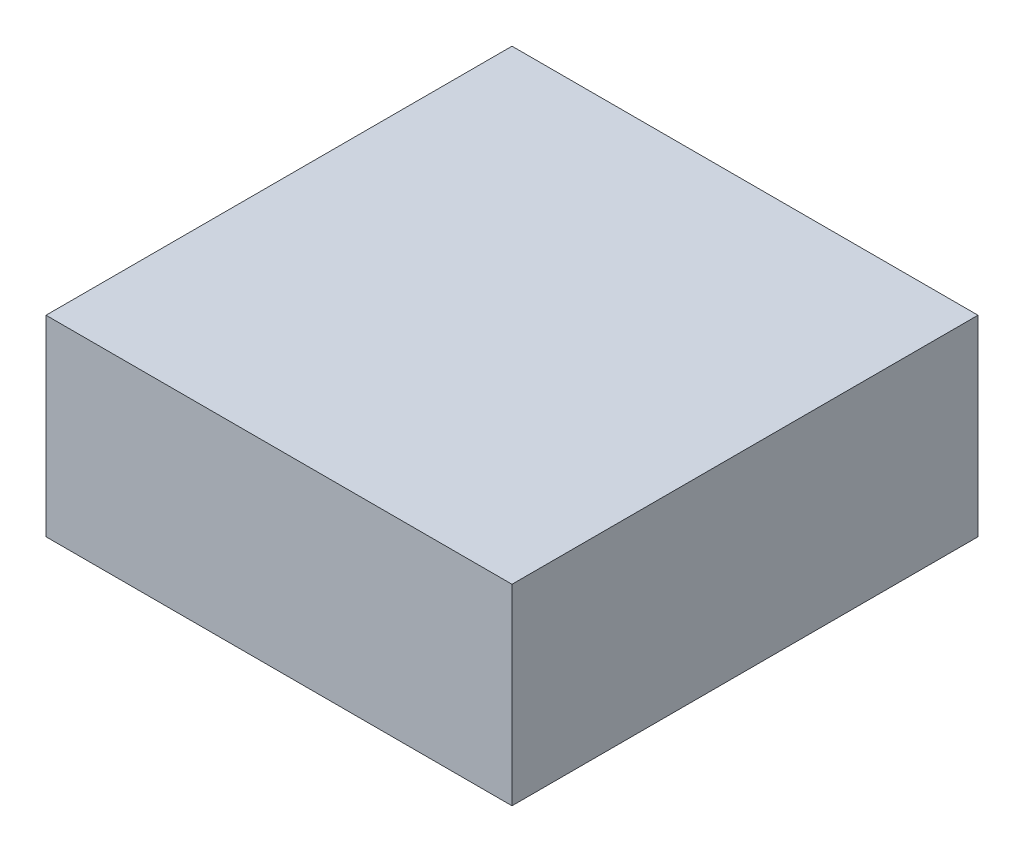
ISO-10303-21;
HEADER;
FILE_DESCRIPTION(('STEP AP214'),'2;1');
FILE_NAME('part.step','',(''),(''),'','','');
FILE_SCHEMA(('AUTOMOTIVE_DESIGN { 1 0 10303 214 1 1 1 1 }'));
ENDSEC;
DATA;
#1=APPLICATION_CONTEXT('core data for automotive mechanical design processes');
#2=APPLICATION_PROTOCOL_DEFINITION('international standard','automotive_design',2000,#1);
#3=PRODUCT_CONTEXT('',#1,'mechanical');
#4=PRODUCT('Part','Part','',(#3));
#5=PRODUCT_RELATED_PRODUCT_CATEGORY('part','',(#4));
#6=PRODUCT_DEFINITION_FORMATION('','',#4);
#7=PRODUCT_DEFINITION_CONTEXT('part definition',#1,'design');
#8=PRODUCT_DEFINITION('design','',#6,#7);
#9=PRODUCT_DEFINITION_SHAPE('','',#8);
#10=(LENGTH_UNIT() NAMED_UNIT(*) SI_UNIT(.MILLI.,.METRE.));
#11=(NAMED_UNIT(*) PLANE_ANGLE_UNIT() SI_UNIT($,.RADIAN.));
#12=(NAMED_UNIT(*) SI_UNIT($,.STERADIAN.) SOLID_ANGLE_UNIT());
#13=UNCERTAINTY_MEASURE_WITH_UNIT(LENGTH_MEASURE(1.E-05),#10,'distance_accuracy_value','');
#14=(GEOMETRIC_REPRESENTATION_CONTEXT(3) GLOBAL_UNCERTAINTY_ASSIGNED_CONTEXT((#13)) GLOBAL_UNIT_ASSIGNED_CONTEXT((#10,
#11,#12)) REPRESENTATION_CONTEXT('',''));
#15=CARTESIAN_POINT('',(0.,0.,0.));
#16=DIRECTION('',(0.,0.,1.));
#17=DIRECTION('',(1.,0.,0.));
#18=AXIS2_PLACEMENT_3D('',#15,#16,#17);
#19=CARTESIAN_POINT('',(-0.86,0.95,1.71));
#20=CARTESIAN_POINT('',(0.86,0.95,1.71));
#21=CARTESIAN_POINT('',(-0.86,0.95,-0.01));
#22=CARTESIAN_POINT('',(0.86,0.95,-0.01));
#23=(BOUNDED_SURFACE() B_SPLINE_SURFACE(1,1,((#19,#20),(#21,#22)),.UNSPECIFIED.,.F.,.F.,
.F.) B_SPLINE_SURFACE_WITH_KNOTS((2,2),(2,2),(-0.086,0.086),(-0.086,0.086),
.UNSPECIFIED.) GEOMETRIC_REPRESENTATION_ITEM() RATIONAL_B_SPLINE_SURFACE(((1.,1.),(1.,1.))) REPRESENTATION_ITEM('') SURFACE());
#24=CARTESIAN_POINT('',(0.85,0.95,1.7));
#25=CARTESIAN_POINT('',(0.85,0.95,0.));
#26=(BOUNDED_CURVE() B_SPLINE_CURVE(1,(#24,#25),.UNSPECIFIED.,.F.,
.F.) B_SPLINE_CURVE_WITH_KNOTS((2,2),(-0.1275,0.0425),
.UNSPECIFIED.) CURVE() GEOMETRIC_REPRESENTATION_ITEM() RATIONAL_B_SPLINE_CURVE((1.,1.)) REPRESENTATION_ITEM(''));
#27=CARTESIAN_POINT('',(0.85,0.95,1.7));
#28=VERTEX_POINT('',#27);
#29=CARTESIAN_POINT('',(0.85,0.95,0.));
#30=VERTEX_POINT('',#29);
#31=EDGE_CURVE('E152',#28,#30,#26,.T.);
#32=CARTESIAN_POINT('',(-0.85,0.95,1.7));
#33=CARTESIAN_POINT('',(0.85,0.95,1.7));
#34=(BOUNDED_CURVE() B_SPLINE_CURVE(1,(#32,#33),.UNSPECIFIED.,.F.,
.F.) B_SPLINE_CURVE_WITH_KNOTS((2,2),(-0.085,0.085),
.UNSPECIFIED.) CURVE() GEOMETRIC_REPRESENTATION_ITEM() RATIONAL_B_SPLINE_CURVE((1.,1.)) REPRESENTATION_ITEM(''));
#35=CARTESIAN_POINT('',(-0.85,0.95,1.7));
#36=VERTEX_POINT('',#35);
#37=EDGE_CURVE('E61',#36,#28,#34,.T.);
#38=CARTESIAN_POINT('',(-0.85,0.95,0.));
#39=CARTESIAN_POINT('',(-0.85,0.95,1.7));
#40=(BOUNDED_CURVE() B_SPLINE_CURVE(1,(#38,#39),.UNSPECIFIED.,.F.,
.F.) B_SPLINE_CURVE_WITH_KNOTS((2,2),(-0.0425,0.1275),
.UNSPECIFIED.) CURVE() GEOMETRIC_REPRESENTATION_ITEM() RATIONAL_B_SPLINE_CURVE((1.,1.)) REPRESENTATION_ITEM(''));
#41=CARTESIAN_POINT('',(-0.85,0.95,0.));
#42=VERTEX_POINT('',#41);
#43=EDGE_CURVE('E11',#42,#36,#40,.T.);
#44=CARTESIAN_POINT('',(0.85,0.95,0.));
#45=CARTESIAN_POINT('',(-0.85,0.95,0.));
#46=(BOUNDED_CURVE() B_SPLINE_CURVE(1,(#44,#45),.UNSPECIFIED.,.F.,
.F.) B_SPLINE_CURVE_WITH_KNOTS((2,2),(-0.085,0.085),
.UNSPECIFIED.) CURVE() GEOMETRIC_REPRESENTATION_ITEM() RATIONAL_B_SPLINE_CURVE((1.,1.)) REPRESENTATION_ITEM(''));
#47=EDGE_CURVE('E87',#30,#42,#46,.T.);
#48=ORIENTED_EDGE('',*,*,#31,.F.);
#49=ORIENTED_EDGE('',*,*,#37,.F.);
#50=ORIENTED_EDGE('',*,*,#43,.F.);
#51=ORIENTED_EDGE('',*,*,#47,.F.);
#52=EDGE_LOOP('',(#48,#49,#50,#51));
#53=FACE_BOUND('',#52,.T.);
#54=ADVANCED_FACE('F17',(#53),#23,.T.);
#55=CARTESIAN_POINT('',(-0.85,1.66,-0.01));
#56=CARTESIAN_POINT('',(-0.85,1.66,1.71));
#57=CARTESIAN_POINT('',(-0.85,0.94,-0.01));
#58=CARTESIAN_POINT('',(-0.85,0.94,1.71));
#59=(BOUNDED_SURFACE() B_SPLINE_SURFACE(1,1,((#55,#56),(#57,#58)),.UNSPECIFIED.,.F.,.F.,
.F.) B_SPLINE_SURFACE_WITH_KNOTS((2,2),(2,2),(-0.001,0.071),(-0.001,0.171),
.UNSPECIFIED.) GEOMETRIC_REPRESENTATION_ITEM() RATIONAL_B_SPLINE_SURFACE(((1.,1.),(1.,1.))) REPRESENTATION_ITEM('') SURFACE());
#60=CARTESIAN_POINT('',(-0.85,1.65,1.7));
#61=CARTESIAN_POINT('',(-0.85,0.95,1.7));
#62=(BOUNDED_CURVE() B_SPLINE_CURVE(1,(#60,#61),.UNSPECIFIED.,.F.,
.F.) B_SPLINE_CURVE_WITH_KNOTS((2,2),(-0.33,-0.26),
.UNSPECIFIED.) CURVE() GEOMETRIC_REPRESENTATION_ITEM() RATIONAL_B_SPLINE_CURVE((1.,1.)) REPRESENTATION_ITEM(''));
#63=CARTESIAN_POINT('',(-0.85,1.65,1.7));
#64=VERTEX_POINT('',#63);
#65=EDGE_CURVE('E32',#64,#36,#62,.T.);
#66=CARTESIAN_POINT('',(-0.85,1.65,0.));
#67=CARTESIAN_POINT('',(-0.85,1.65,1.7));
#68=(BOUNDED_CURVE() B_SPLINE_CURVE(1,(#66,#67),.UNSPECIFIED.,.F.,
.F.) B_SPLINE_CURVE_WITH_KNOTS((2,2),(0.,0.17),
.UNSPECIFIED.) CURVE() GEOMETRIC_REPRESENTATION_ITEM() RATIONAL_B_SPLINE_CURVE((1.,1.)) REPRESENTATION_ITEM(''));
#69=CARTESIAN_POINT('',(-0.85,1.65,0.));
#70=VERTEX_POINT('',#69);
#71=EDGE_CURVE('E78',#70,#64,#68,.T.);
#72=CARTESIAN_POINT('',(-0.85,0.95,0.));
#73=CARTESIAN_POINT('',(-0.85,1.65,0.));
#74=(BOUNDED_CURVE() B_SPLINE_CURVE(1,(#72,#73),.UNSPECIFIED.,.F.,
.F.) B_SPLINE_CURVE_WITH_KNOTS((2,2),(0.26,0.33),
.UNSPECIFIED.) CURVE() GEOMETRIC_REPRESENTATION_ITEM() RATIONAL_B_SPLINE_CURVE((1.,1.)) REPRESENTATION_ITEM(''));
#75=EDGE_CURVE('E89',#42,#70,#74,.T.);
#76=ORIENTED_EDGE('',*,*,#43,.T.);
#77=ORIENTED_EDGE('',*,*,#65,.F.);
#78=ORIENTED_EDGE('',*,*,#71,.F.);
#79=ORIENTED_EDGE('',*,*,#75,.F.);
#80=EDGE_LOOP('',(#76,#77,#78,#79));
#81=FACE_BOUND('',#80,.T.);
#82=ADVANCED_FACE('F90',(#81),#59,.T.);
#83=CARTESIAN_POINT('',(-0.86,0.94,1.7));
#84=CARTESIAN_POINT('',(-0.86,1.66,1.7));
#85=CARTESIAN_POINT('',(0.86,0.94,1.7));
#86=CARTESIAN_POINT('',(0.86,1.66,1.7));
#87=(BOUNDED_SURFACE() B_SPLINE_SURFACE(1,1,((#83,#84),(#85,#86)),.UNSPECIFIED.,.F.,.F.,
.F.) B_SPLINE_SURFACE_WITH_KNOTS((2,2),(2,2),(-0.086,0.086),(0.094,0.166),
.UNSPECIFIED.) GEOMETRIC_REPRESENTATION_ITEM() RATIONAL_B_SPLINE_SURFACE(((1.,1.),(1.,1.))) REPRESENTATION_ITEM('') SURFACE());
#88=CARTESIAN_POINT('',(0.85,0.95,1.7));
#89=CARTESIAN_POINT('',(0.85,1.65,1.7));
#90=(BOUNDED_CURVE() B_SPLINE_CURVE(1,(#88,#89),.UNSPECIFIED.,.F.,
.F.) B_SPLINE_CURVE_WITH_KNOTS((2,2),(-0.07,0.),
.UNSPECIFIED.) CURVE() GEOMETRIC_REPRESENTATION_ITEM() RATIONAL_B_SPLINE_CURVE((1.,1.)) REPRESENTATION_ITEM(''));
#91=CARTESIAN_POINT('',(0.85,1.65,1.7));
#92=VERTEX_POINT('',#91);
#93=EDGE_CURVE('E130',#28,#92,#90,.T.);
#94=CARTESIAN_POINT('',(0.85,1.65,1.7));
#95=CARTESIAN_POINT('',(-0.85,1.65,1.7));
#96=(BOUNDED_CURVE() B_SPLINE_CURVE(1,(#94,#95),.UNSPECIFIED.,.F.,
.F.) B_SPLINE_CURVE_WITH_KNOTS((2,2),(-0.17,0.),
.UNSPECIFIED.) CURVE() GEOMETRIC_REPRESENTATION_ITEM() RATIONAL_B_SPLINE_CURVE((1.,1.)) REPRESENTATION_ITEM(''));
#97=EDGE_CURVE('E129',#92,#64,#96,.T.);
#98=ORIENTED_EDGE('',*,*,#37,.T.);
#99=ORIENTED_EDGE('',*,*,#93,.T.);
#100=ORIENTED_EDGE('',*,*,#97,.T.);
#101=ORIENTED_EDGE('',*,*,#65,.T.);
#102=EDGE_LOOP('',(#98,#99,#100,#101));
#103=FACE_BOUND('',#102,.T.);
#104=ADVANCED_FACE('F233',(#103),#87,.T.);
#105=CARTESIAN_POINT('',(0.86,1.65,-0.01));
#106=CARTESIAN_POINT('',(0.86,1.65,1.71));
#107=CARTESIAN_POINT('',(-0.86,1.65,-0.01));
#108=CARTESIAN_POINT('',(-0.86,1.65,1.71));
#109=(BOUNDED_SURFACE() B_SPLINE_SURFACE(1,1,((#105,#106),(#107,#108)),.UNSPECIFIED.,.F.,.F.,
.F.) B_SPLINE_SURFACE_WITH_KNOTS((2,2),(2,2),(-0.001,0.171),(-0.001,0.171),
.UNSPECIFIED.) GEOMETRIC_REPRESENTATION_ITEM() RATIONAL_B_SPLINE_SURFACE(((1.,1.),(1.,1.))) REPRESENTATION_ITEM('') SURFACE());
#110=CARTESIAN_POINT('',(-0.85,1.65,0.));
#111=CARTESIAN_POINT('',(0.85,1.65,0.));
#112=(BOUNDED_CURVE() B_SPLINE_CURVE(1,(#110,#111),.UNSPECIFIED.,.F.,
.F.) B_SPLINE_CURVE_WITH_KNOTS((2,2),(0.,0.17),
.UNSPECIFIED.) CURVE() GEOMETRIC_REPRESENTATION_ITEM() RATIONAL_B_SPLINE_CURVE((1.,1.)) REPRESENTATION_ITEM(''));
#113=CARTESIAN_POINT('',(0.85,1.65,0.));
#114=VERTEX_POINT('',#113);
#115=EDGE_CURVE('E94',#70,#114,#112,.T.);
#116=CARTESIAN_POINT('',(0.85,1.65,0.));
#117=CARTESIAN_POINT('',(0.85,1.65,1.7));
#118=(BOUNDED_CURVE() B_SPLINE_CURVE(1,(#116,#117),.UNSPECIFIED.,.F.,
.F.) B_SPLINE_CURVE_WITH_KNOTS((2,2),(0.,0.17),
.UNSPECIFIED.) CURVE() GEOMETRIC_REPRESENTATION_ITEM() RATIONAL_B_SPLINE_CURVE((1.,1.)) REPRESENTATION_ITEM(''));
#119=EDGE_CURVE('E73',#114,#92,#118,.T.);
#120=ORIENTED_EDGE('',*,*,#115,.F.);
#121=ORIENTED_EDGE('',*,*,#71,.T.);
#122=ORIENTED_EDGE('',*,*,#97,.F.);
#123=ORIENTED_EDGE('',*,*,#119,.F.);
#124=EDGE_LOOP('',(#120,#121,#122,#123));
#125=FACE_BOUND('',#124,.T.);
#126=ADVANCED_FACE('F223',(#125),#109,.T.);
#127=CARTESIAN_POINT('',(0.85,0.94,-0.01));
#128=CARTESIAN_POINT('',(0.85,0.94,1.71));
#129=CARTESIAN_POINT('',(0.85,1.66,-0.01));
#130=CARTESIAN_POINT('',(0.85,1.66,1.71));
#131=(BOUNDED_SURFACE() B_SPLINE_SURFACE(1,1,((#127,#128),(#129,#130)),.UNSPECIFIED.,.F.,.F.,
.F.) B_SPLINE_SURFACE_WITH_KNOTS((2,2),(2,2),(0.259,0.331),(-0.001,0.171),
.UNSPECIFIED.) GEOMETRIC_REPRESENTATION_ITEM() RATIONAL_B_SPLINE_SURFACE(((1.,1.),(1.,1.))) REPRESENTATION_ITEM('') SURFACE());
#132=CARTESIAN_POINT('',(0.85,1.65,0.));
#133=CARTESIAN_POINT('',(0.85,0.95,0.));
#134=(BOUNDED_CURVE() B_SPLINE_CURVE(1,(#132,#133),.UNSPECIFIED.,.F.,
.F.) B_SPLINE_CURVE_WITH_KNOTS((2,2),(0.,0.07),
.UNSPECIFIED.) CURVE() GEOMETRIC_REPRESENTATION_ITEM() RATIONAL_B_SPLINE_CURVE((1.,1.)) REPRESENTATION_ITEM(''));
#135=EDGE_CURVE('E23',#114,#30,#134,.T.);
#136=ORIENTED_EDGE('',*,*,#31,.T.);
#137=ORIENTED_EDGE('',*,*,#135,.F.);
#138=ORIENTED_EDGE('',*,*,#119,.T.);
#139=ORIENTED_EDGE('',*,*,#93,.F.);
#140=EDGE_LOOP('',(#136,#137,#138,#139));
#141=FACE_BOUND('',#140,.T.);
#142=ADVANCED_FACE('F19',(#141),#131,.T.);
#143=CARTESIAN_POINT('',(0.86,0.94,0.));
#144=CARTESIAN_POINT('',(0.86,1.66,0.));
#145=CARTESIAN_POINT('',(-0.86,0.94,0.));
#146=CARTESIAN_POINT('',(-0.86,1.66,0.));
#147=(BOUNDED_SURFACE() B_SPLINE_SURFACE(1,1,((#143,#144),(#145,#146)),.UNSPECIFIED.,.F.,.F.,
.F.) B_SPLINE_SURFACE_WITH_KNOTS((2,2),(2,2),(-0.086,0.086),(0.094,0.166),
.UNSPECIFIED.) GEOMETRIC_REPRESENTATION_ITEM() RATIONAL_B_SPLINE_SURFACE(((1.,1.),(1.,1.))) REPRESENTATION_ITEM('') SURFACE());
#148=ORIENTED_EDGE('',*,*,#47,.T.);
#149=ORIENTED_EDGE('',*,*,#75,.T.);
#150=ORIENTED_EDGE('',*,*,#115,.T.);
#151=ORIENTED_EDGE('',*,*,#135,.T.);
#152=EDGE_LOOP('',(#148,#149,#150,#151));
#153=FACE_BOUND('',#152,.T.);
#154=ADVANCED_FACE('F97',(#153),#147,.T.);
#155=CLOSED_SHELL('',(#54,#82,#104,#126,#142,#154));
#156=MANIFOLD_SOLID_BREP('B1',#155);
#157=ADVANCED_BREP_SHAPE_REPRESENTATION('',(#18,#156),#14);
#158=SHAPE_DEFINITION_REPRESENTATION(#9,#157);
ENDSEC;
END-ISO-10303-21;
